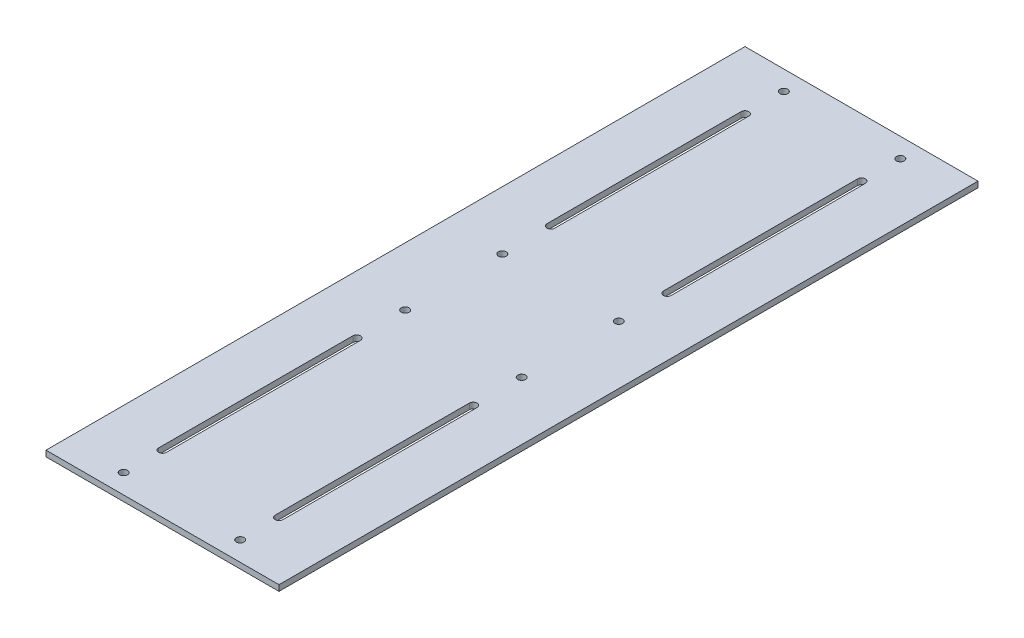
ISO-10303-21;
HEADER;
FILE_DESCRIPTION(('STEP AP214'),'2;1');
FILE_NAME('part.step','',(''),(''),'','','');
FILE_SCHEMA(('AUTOMOTIVE_DESIGN { 1 0 10303 214 1 1 1 1 }'));
ENDSEC;
DATA;
#1=APPLICATION_CONTEXT('core data for automotive mechanical design processes');
#2=APPLICATION_PROTOCOL_DEFINITION('international standard','automotive_design',2000,#1);
#3=PRODUCT_CONTEXT('',#1,'mechanical');
#4=PRODUCT('Part','Part','',(#3));
#5=PRODUCT_RELATED_PRODUCT_CATEGORY('part','',(#4));
#6=PRODUCT_DEFINITION_FORMATION('','',#4);
#7=PRODUCT_DEFINITION_CONTEXT('part definition',#1,'design');
#8=PRODUCT_DEFINITION('design','',#6,#7);
#9=PRODUCT_DEFINITION_SHAPE('','',#8);
#10=(LENGTH_UNIT() NAMED_UNIT(*) SI_UNIT(.MILLI.,.METRE.));
#11=(NAMED_UNIT(*) PLANE_ANGLE_UNIT() SI_UNIT($,.RADIAN.));
#12=(NAMED_UNIT(*) SI_UNIT($,.STERADIAN.) SOLID_ANGLE_UNIT());
#13=UNCERTAINTY_MEASURE_WITH_UNIT(LENGTH_MEASURE(1.E-05),#10,'distance_accuracy_value','');
#14=(GEOMETRIC_REPRESENTATION_CONTEXT(3) GLOBAL_UNCERTAINTY_ASSIGNED_CONTEXT((#13)) GLOBAL_UNIT_ASSIGNED_CONTEXT((#10,
#11,#12)) REPRESENTATION_CONTEXT('',''));
#15=CARTESIAN_POINT('',(0.,0.,0.));
#16=DIRECTION('',(0.,0.,1.));
#17=DIRECTION('',(1.,0.,0.));
#18=AXIS2_PLACEMENT_3D('',#15,#16,#17);
#19=CARTESIAN_POINT('',(60.,3.,180.));
#20=DIRECTION('',(-1.,0.,0.));
#21=DIRECTION('',(0.,0.,1.));
#22=AXIS2_PLACEMENT_3D('',#19,#20,#21);
#23=PLANE('',#22);
#24=DIRECTION('',(0.,0.,-1.));
#25=VECTOR('',#24,1.);
#26=CARTESIAN_POINT('',(60.,0.,180.));
#27=LINE('',#26,#25);
#28=CARTESIAN_POINT('',(60.,0.,180.));
#29=VERTEX_POINT('',#28);
#30=CARTESIAN_POINT('',(60.,0.,-180.));
#31=VERTEX_POINT('',#30);
#32=EDGE_CURVE('E347',#29,#31,#27,.T.);
#33=ORIENTED_EDGE('',*,*,#32,.T.);
#34=DIRECTION('',(0.,-1.,0.));
#35=VECTOR('',#34,1.);
#36=CARTESIAN_POINT('',(60.,3.,-180.));
#37=LINE('',#36,#35);
#38=CARTESIAN_POINT('',(60.,3.,-180.));
#39=VERTEX_POINT('',#38);
#40=EDGE_CURVE('E11',#39,#31,#37,.T.);
#41=ORIENTED_EDGE('',*,*,#40,.F.);
#42=DIRECTION('',(0.,0.,-1.));
#43=VECTOR('',#42,1.);
#44=CARTESIAN_POINT('',(60.,3.,180.));
#45=LINE('',#44,#43);
#46=CARTESIAN_POINT('',(60.,3.,180.));
#47=VERTEX_POINT('',#46);
#48=EDGE_CURVE('E350',#47,#39,#45,.T.);
#49=ORIENTED_EDGE('',*,*,#48,.F.);
#50=DIRECTION('',(0.,-1.,0.));
#51=VECTOR('',#50,1.);
#52=CARTESIAN_POINT('',(60.,3.,180.));
#53=LINE('',#52,#51);
#54=EDGE_CURVE('E360',#47,#29,#53,.T.);
#55=ORIENTED_EDGE('',*,*,#54,.T.);
#56=EDGE_LOOP('',(#33,#41,#49,#55));
#57=FACE_BOUND('',#56,.T.);
#58=ADVANCED_FACE('F33',(#57),#23,.F.);
#59=CARTESIAN_POINT('',(-60.,3.,-180.));
#60=DIRECTION('',(0.,0.,1.));
#61=DIRECTION('',(1.,0.,0.));
#62=AXIS2_PLACEMENT_3D('',#59,#60,#61);
#63=PLANE('',#62);
#64=DIRECTION('',(-1.,0.,0.));
#65=VECTOR('',#64,1.);
#66=CARTESIAN_POINT('',(-60.,0.,-180.));
#67=LINE('',#66,#65);
#68=CARTESIAN_POINT('',(-60.,0.,-180.));
#69=VERTEX_POINT('',#68);
#70=EDGE_CURVE('E363',#31,#69,#67,.T.);
#71=ORIENTED_EDGE('',*,*,#70,.T.);
#72=DIRECTION('',(0.,-1.,0.));
#73=VECTOR('',#72,1.);
#74=CARTESIAN_POINT('',(-60.,3.,-180.));
#75=LINE('',#74,#73);
#76=CARTESIAN_POINT('',(-60.,3.,-180.));
#77=VERTEX_POINT('',#76);
#78=EDGE_CURVE('E40',#77,#69,#75,.T.);
#79=ORIENTED_EDGE('',*,*,#78,.F.);
#80=DIRECTION('',(-1.,0.,0.));
#81=VECTOR('',#80,1.);
#82=CARTESIAN_POINT('',(-60.,3.,-180.));
#83=LINE('',#82,#81);
#84=EDGE_CURVE('E353',#39,#77,#83,.T.);
#85=ORIENTED_EDGE('',*,*,#84,.F.);
#86=ORIENTED_EDGE('',*,*,#40,.T.);
#87=EDGE_LOOP('',(#71,#79,#85,#86));
#88=FACE_BOUND('',#87,.T.);
#89=ADVANCED_FACE('F392',(#88),#63,.F.);
#90=CARTESIAN_POINT('',(-60.,3.,180.));
#91=DIRECTION('',(1.,0.,0.));
#92=DIRECTION('',(0.,0.,-1.));
#93=AXIS2_PLACEMENT_3D('',#90,#91,#92);
#94=PLANE('',#93);
#95=DIRECTION('',(0.,0.,1.));
#96=VECTOR('',#95,1.);
#97=CARTESIAN_POINT('',(-60.,0.,180.));
#98=LINE('',#97,#96);
#99=CARTESIAN_POINT('',(-60.,0.,180.));
#100=VERTEX_POINT('',#99);
#101=EDGE_CURVE('E365',#69,#100,#98,.T.);
#102=ORIENTED_EDGE('',*,*,#101,.T.);
#103=DIRECTION('',(0.,-1.,0.));
#104=VECTOR('',#103,1.);
#105=CARTESIAN_POINT('',(-60.,3.,180.));
#106=LINE('',#105,#104);
#107=CARTESIAN_POINT('',(-60.,3.,180.));
#108=VERTEX_POINT('',#107);
#109=EDGE_CURVE('E370',#108,#100,#106,.T.);
#110=ORIENTED_EDGE('',*,*,#109,.F.);
#111=DIRECTION('',(0.,0.,1.));
#112=VECTOR('',#111,1.);
#113=CARTESIAN_POINT('',(-60.,3.,180.));
#114=LINE('',#113,#112);
#115=EDGE_CURVE('E356',#77,#108,#114,.T.);
#116=ORIENTED_EDGE('',*,*,#115,.F.);
#117=ORIENTED_EDGE('',*,*,#78,.T.);
#118=EDGE_LOOP('',(#102,#110,#116,#117));
#119=FACE_BOUND('',#118,.T.);
#120=ADVANCED_FACE('F377',(#119),#94,.F.);
#121=CARTESIAN_POINT('',(-60.,3.,180.));
#122=DIRECTION('',(0.,0.,-1.));
#123=DIRECTION('',(-1.,0.,0.));
#124=AXIS2_PLACEMENT_3D('',#121,#122,#123);
#125=PLANE('',#124);
#126=DIRECTION('',(1.,0.,0.));
#127=VECTOR('',#126,1.);
#128=CARTESIAN_POINT('',(-60.,0.,180.));
#129=LINE('',#128,#127);
#130=EDGE_CURVE('E354',#100,#29,#129,.T.);
#131=ORIENTED_EDGE('',*,*,#130,.T.);
#132=ORIENTED_EDGE('',*,*,#54,.F.);
#133=DIRECTION('',(1.,0.,0.));
#134=VECTOR('',#133,1.);
#135=CARTESIAN_POINT('',(-60.,3.,180.));
#136=LINE('',#135,#134);
#137=EDGE_CURVE('E358',#108,#47,#136,.T.);
#138=ORIENTED_EDGE('',*,*,#137,.F.);
#139=ORIENTED_EDGE('',*,*,#109,.T.);
#140=EDGE_LOOP('',(#131,#132,#138,#139));
#141=FACE_BOUND('',#140,.T.);
#142=ADVANCED_FACE('F385',(#141),#125,.F.);
#143=CARTESIAN_POINT('',(0.,3.,0.));
#144=DIRECTION('',(0.,-1.,0.));
#145=DIRECTION('',(0.,0.,-1.));
#146=AXIS2_PLACEMENT_3D('',#143,#144,#145);
#147=PLANE('',#146);
#148=DIRECTION('',(0.,0.,-1.));
#149=VECTOR('',#148,1.);
#150=CARTESIAN_POINT('',(-28.,3.,150.));
#151=LINE('',#150,#149);
#152=CARTESIAN_POINT('',(-28.,3.,150.));
#153=VERTEX_POINT('',#152);
#154=CARTESIAN_POINT('',(-28.,3.,50.));
#155=VERTEX_POINT('',#154);
#156=EDGE_CURVE('E196',#153,#155,#151,.T.);
#157=ORIENTED_EDGE('',*,*,#156,.F.);
#158=CARTESIAN_POINT('',(-30.,3.,150.));
#159=DIRECTION('',(0.,1.,0.));
#160=DIRECTION('',(0.,0.,1.));
#161=AXIS2_PLACEMENT_3D('',#158,#159,#160);
#162=CIRCLE('',#161,2.);
#163=CARTESIAN_POINT('',(-32.,3.,150.));
#164=VERTEX_POINT('',#163);
#165=EDGE_CURVE('E47',#164,#153,#162,.T.);
#166=ORIENTED_EDGE('',*,*,#165,.F.);
#167=DIRECTION('',(0.,0.,1.));
#168=VECTOR('',#167,1.);
#169=CARTESIAN_POINT('',(-32.,3.,150.));
#170=LINE('',#169,#168);
#171=CARTESIAN_POINT('',(-32.,3.,50.));
#172=VERTEX_POINT('',#171);
#173=EDGE_CURVE('E187',#172,#164,#170,.T.);
#174=ORIENTED_EDGE('',*,*,#173,.F.);
#175=CARTESIAN_POINT('',(-30.,3.,50.));
#176=DIRECTION('',(0.,1.,0.));
#177=DIRECTION('',(0.,0.,1.));
#178=AXIS2_PLACEMENT_3D('',#175,#176,#177);
#179=CIRCLE('',#178,2.);
#180=EDGE_CURVE('E190',#155,#172,#179,.T.);
#181=ORIENTED_EDGE('',*,*,#180,.F.);
#182=EDGE_LOOP('',(#157,#166,#174,#181));
#183=FACE_BOUND('',#182,.T.);
#184=DIRECTION('',(0.,0.,-1.));
#185=VECTOR('',#184,1.);
#186=CARTESIAN_POINT('',(32.,3.,150.));
#187=LINE('',#186,#185);
#188=CARTESIAN_POINT('',(32.,3.,150.));
#189=VERTEX_POINT('',#188);
#190=CARTESIAN_POINT('',(32.,3.,50.));
#191=VERTEX_POINT('',#190);
#192=EDGE_CURVE('E221',#189,#191,#187,.T.);
#193=ORIENTED_EDGE('',*,*,#192,.F.);
#194=CARTESIAN_POINT('',(30.,3.,150.));
#195=DIRECTION('',(0.,1.,0.));
#196=DIRECTION('',(0.,0.,1.));
#197=AXIS2_PLACEMENT_3D('',#194,#195,#196);
#198=CIRCLE('',#197,2.);
#199=CARTESIAN_POINT('',(28.,3.,150.));
#200=VERTEX_POINT('',#199);
#201=EDGE_CURVE('E202',#200,#189,#198,.T.);
#202=ORIENTED_EDGE('',*,*,#201,.F.);
#203=DIRECTION('',(0.,0.,1.));
#204=VECTOR('',#203,1.);
#205=CARTESIAN_POINT('',(28.,3.,150.));
#206=LINE('',#205,#204);
#207=CARTESIAN_POINT('',(28.,3.,50.));
#208=VERTEX_POINT('',#207);
#209=EDGE_CURVE('E210',#208,#200,#206,.T.);
#210=ORIENTED_EDGE('',*,*,#209,.F.);
#211=CARTESIAN_POINT('',(30.,3.,50.));
#212=DIRECTION('',(0.,1.,0.));
#213=DIRECTION('',(0.,0.,1.));
#214=AXIS2_PLACEMENT_3D('',#211,#212,#213);
#215=CIRCLE('',#214,2.);
#216=EDGE_CURVE('E224',#191,#208,#215,.T.);
#217=ORIENTED_EDGE('',*,*,#216,.F.);
#218=EDGE_LOOP('',(#193,#202,#210,#217));
#219=FACE_BOUND('',#218,.T.);
#220=DIRECTION('',(0.,0.,1.));
#221=VECTOR('',#220,1.);
#222=CARTESIAN_POINT('',(-32.,3.,-150.));
#223=LINE('',#222,#221);
#224=CARTESIAN_POINT('',(-32.,3.,-150.));
#225=VERTEX_POINT('',#224);
#226=CARTESIAN_POINT('',(-32.,3.,-50.));
#227=VERTEX_POINT('',#226);
#228=EDGE_CURVE('E253',#225,#227,#223,.T.);
#229=ORIENTED_EDGE('',*,*,#228,.F.);
#230=CARTESIAN_POINT('',(-30.,3.,-150.));
#231=DIRECTION('',(0.,1.,0.));
#232=DIRECTION('',(0.,0.,1.));
#233=AXIS2_PLACEMENT_3D('',#230,#231,#232);
#234=CIRCLE('',#233,2.00000000000001);
#235=CARTESIAN_POINT('',(-28.,3.,-150.));
#236=VERTEX_POINT('',#235);
#237=EDGE_CURVE('E231',#236,#225,#234,.T.);
#238=ORIENTED_EDGE('',*,*,#237,.F.);
#239=DIRECTION('',(0.,0.,-1.));
#240=VECTOR('',#239,1.);
#241=CARTESIAN_POINT('',(-28.,3.,-150.));
#242=LINE('',#241,#240);
#243=CARTESIAN_POINT('',(-28.,3.,-50.));
#244=VERTEX_POINT('',#243);
#245=EDGE_CURVE('E242',#244,#236,#242,.T.);
#246=ORIENTED_EDGE('',*,*,#245,.F.);
#247=CARTESIAN_POINT('',(-30.,3.,-50.));
#248=DIRECTION('',(0.,1.,0.));
#249=DIRECTION('',(0.,0.,1.));
#250=AXIS2_PLACEMENT_3D('',#247,#248,#249);
#251=CIRCLE('',#250,2.);
#252=EDGE_CURVE('E256',#227,#244,#251,.T.);
#253=ORIENTED_EDGE('',*,*,#252,.F.);
#254=EDGE_LOOP('',(#229,#238,#246,#253));
#255=FACE_BOUND('',#254,.T.);
#256=DIRECTION('',(0.,0.,1.));
#257=VECTOR('',#256,1.);
#258=CARTESIAN_POINT('',(28.,3.,-150.));
#259=LINE('',#258,#257);
#260=CARTESIAN_POINT('',(28.,3.,-150.));
#261=VERTEX_POINT('',#260);
#262=CARTESIAN_POINT('',(28.,3.,-50.));
#263=VERTEX_POINT('',#262);
#264=EDGE_CURVE('E285',#261,#263,#259,.T.);
#265=ORIENTED_EDGE('',*,*,#264,.F.);
#266=CARTESIAN_POINT('',(30.,3.,-150.));
#267=DIRECTION('',(0.,1.,0.));
#268=DIRECTION('',(0.,0.,1.));
#269=AXIS2_PLACEMENT_3D('',#266,#267,#268);
#270=CIRCLE('',#269,2.00000000000001);
#271=CARTESIAN_POINT('',(32.,3.,-150.));
#272=VERTEX_POINT('',#271);
#273=EDGE_CURVE('E263',#272,#261,#270,.T.);
#274=ORIENTED_EDGE('',*,*,#273,.F.);
#275=DIRECTION('',(0.,0.,-1.));
#276=VECTOR('',#275,1.);
#277=CARTESIAN_POINT('',(32.,3.,-150.));
#278=LINE('',#277,#276);
#279=CARTESIAN_POINT('',(32.,3.,-50.));
#280=VERTEX_POINT('',#279);
#281=EDGE_CURVE('E274',#280,#272,#278,.T.);
#282=ORIENTED_EDGE('',*,*,#281,.F.);
#283=CARTESIAN_POINT('',(30.,3.,-50.));
#284=DIRECTION('',(0.,1.,0.));
#285=DIRECTION('',(0.,0.,1.));
#286=AXIS2_PLACEMENT_3D('',#283,#284,#285);
#287=CIRCLE('',#286,2.);
#288=EDGE_CURVE('E288',#263,#280,#287,.T.);
#289=ORIENTED_EDGE('',*,*,#288,.F.);
#290=EDGE_LOOP('',(#265,#274,#282,#289));
#291=FACE_BOUND('',#290,.T.);
#292=CARTESIAN_POINT('',(30.,3.,25.));
#293=DIRECTION('',(0.,1.,0.));
#294=DIRECTION('',(0.,0.,1.));
#295=AXIS2_PLACEMENT_3D('',#292,#293,#294);
#296=CIRCLE('',#295,2.);
#297=CARTESIAN_POINT('',(30.,3.,27.));
#298=VERTEX_POINT('',#297);
#299=EDGE_CURVE('E295',#298,#298,#296,.T.);
#300=ORIENTED_EDGE('',*,*,#299,.F.);
#301=EDGE_LOOP('',(#300));
#302=FACE_BOUND('',#301,.T.);
#303=CARTESIAN_POINT('',(-30.,3.,25.));
#304=DIRECTION('',(0.,1.,0.));
#305=DIRECTION('',(0.,0.,1.));
#306=AXIS2_PLACEMENT_3D('',#303,#304,#305);
#307=CIRCLE('',#306,2.);
#308=CARTESIAN_POINT('',(-30.,3.,27.));
#309=VERTEX_POINT('',#308);
#310=EDGE_CURVE('E305',#309,#309,#307,.T.);
#311=ORIENTED_EDGE('',*,*,#310,.F.);
#312=EDGE_LOOP('',(#311));
#313=FACE_BOUND('',#312,.T.);
#314=CARTESIAN_POINT('',(30.,3.,-25.));
#315=DIRECTION('',(0.,1.,0.));
#316=DIRECTION('',(0.,0.,1.));
#317=AXIS2_PLACEMENT_3D('',#314,#315,#316);
#318=CIRCLE('',#317,2.);
#319=CARTESIAN_POINT('',(30.,3.,-23.));
#320=VERTEX_POINT('',#319);
#321=EDGE_CURVE('E311',#320,#320,#318,.T.);
#322=ORIENTED_EDGE('',*,*,#321,.F.);
#323=EDGE_LOOP('',(#322));
#324=FACE_BOUND('',#323,.T.);
#325=CARTESIAN_POINT('',(30.,3.,170.));
#326=DIRECTION('',(0.,1.,0.));
#327=DIRECTION('',(0.,0.,1.));
#328=AXIS2_PLACEMENT_3D('',#325,#326,#327);
#329=CIRCLE('',#328,2.);
#330=CARTESIAN_POINT('',(30.,3.,172.));
#331=VERTEX_POINT('',#330);
#332=EDGE_CURVE('E317',#331,#331,#329,.T.);
#333=ORIENTED_EDGE('',*,*,#332,.F.);
#334=EDGE_LOOP('',(#333));
#335=FACE_BOUND('',#334,.T.);
#336=CARTESIAN_POINT('',(-30.,3.,-25.));
#337=DIRECTION('',(0.,1.,0.));
#338=DIRECTION('',(0.,0.,1.));
#339=AXIS2_PLACEMENT_3D('',#336,#337,#338);
#340=CIRCLE('',#339,2.);
#341=CARTESIAN_POINT('',(-30.,3.,-23.));
#342=VERTEX_POINT('',#341);
#343=EDGE_CURVE('E323',#342,#342,#340,.T.);
#344=ORIENTED_EDGE('',*,*,#343,.F.);
#345=EDGE_LOOP('',(#344));
#346=FACE_BOUND('',#345,.T.);
#347=CARTESIAN_POINT('',(-30.,3.,170.));
#348=DIRECTION('',(0.,1.,0.));
#349=DIRECTION('',(0.,0.,1.));
#350=AXIS2_PLACEMENT_3D('',#347,#348,#349);
#351=CIRCLE('',#350,2.);
#352=CARTESIAN_POINT('',(-30.,3.,172.));
#353=VERTEX_POINT('',#352);
#354=EDGE_CURVE('E329',#353,#353,#351,.T.);
#355=ORIENTED_EDGE('',*,*,#354,.F.);
#356=EDGE_LOOP('',(#355));
#357=FACE_BOUND('',#356,.T.);
#358=CARTESIAN_POINT('',(30.,3.,-170.));
#359=DIRECTION('',(0.,1.,0.));
#360=DIRECTION('',(0.,0.,1.));
#361=AXIS2_PLACEMENT_3D('',#358,#359,#360);
#362=CIRCLE('',#361,2.);
#363=CARTESIAN_POINT('',(30.,3.,-168.));
#364=VERTEX_POINT('',#363);
#365=EDGE_CURVE('E335',#364,#364,#362,.T.);
#366=ORIENTED_EDGE('',*,*,#365,.F.);
#367=EDGE_LOOP('',(#366));
#368=FACE_BOUND('',#367,.T.);
#369=CARTESIAN_POINT('',(-30.,3.,-170.));
#370=DIRECTION('',(0.,1.,0.));
#371=DIRECTION('',(0.,0.,1.));
#372=AXIS2_PLACEMENT_3D('',#369,#370,#371);
#373=CIRCLE('',#372,2.);
#374=CARTESIAN_POINT('',(-30.,3.,-168.));
#375=VERTEX_POINT('',#374);
#376=EDGE_CURVE('E341',#375,#375,#373,.T.);
#377=ORIENTED_EDGE('',*,*,#376,.F.);
#378=EDGE_LOOP('',(#377));
#379=FACE_BOUND('',#378,.T.);
#380=ORIENTED_EDGE('',*,*,#48,.T.);
#381=ORIENTED_EDGE('',*,*,#84,.T.);
#382=ORIENTED_EDGE('',*,*,#115,.T.);
#383=ORIENTED_EDGE('',*,*,#137,.T.);
#384=EDGE_LOOP('',(#380,#381,#382,#383));
#385=FACE_BOUND('',#384,.T.);
#386=ADVANCED_FACE('F391',(#183,#219,#255,#291,#302,#313,#324,#335,#346,#357,#368,#379,#385),
#147,.F.);
#387=CARTESIAN_POINT('',(0.,0.,0.));
#388=DIRECTION('',(0.,-1.,0.));
#389=DIRECTION('',(0.,0.,-1.));
#390=AXIS2_PLACEMENT_3D('',#387,#388,#389);
#391=PLANE('',#390);
#392=CARTESIAN_POINT('',(-30.,0.,150.));
#393=DIRECTION('',(0.,1.,0.));
#394=DIRECTION('',(0.,0.,1.));
#395=AXIS2_PLACEMENT_3D('',#392,#393,#394);
#396=CIRCLE('',#395,2.);
#397=CARTESIAN_POINT('',(-32.,0.,150.));
#398=VERTEX_POINT('',#397);
#399=CARTESIAN_POINT('',(-28.,0.,150.));
#400=VERTEX_POINT('',#399);
#401=EDGE_CURVE('E171',#398,#400,#396,.T.);
#402=ORIENTED_EDGE('',*,*,#401,.T.);
#403=DIRECTION('',(0.,0.,-1.));
#404=VECTOR('',#403,1.);
#405=CARTESIAN_POINT('',(-28.,0.,150.));
#406=LINE('',#405,#404);
#407=CARTESIAN_POINT('',(-28.,0.,50.));
#408=VERTEX_POINT('',#407);
#409=EDGE_CURVE('E180',#400,#408,#406,.T.);
#410=ORIENTED_EDGE('',*,*,#409,.T.);
#411=CARTESIAN_POINT('',(-30.,0.,50.));
#412=DIRECTION('',(0.,1.,0.));
#413=DIRECTION('',(0.,0.,1.));
#414=AXIS2_PLACEMENT_3D('',#411,#412,#413);
#415=CIRCLE('',#414,2.);
#416=CARTESIAN_POINT('',(-32.,0.,50.));
#417=VERTEX_POINT('',#416);
#418=EDGE_CURVE('E55',#408,#417,#415,.T.);
#419=ORIENTED_EDGE('',*,*,#418,.T.);
#420=DIRECTION('',(0.,0.,1.));
#421=VECTOR('',#420,1.);
#422=CARTESIAN_POINT('',(-32.,0.,150.));
#423=LINE('',#422,#421);
#424=EDGE_CURVE('E177',#417,#398,#423,.T.);
#425=ORIENTED_EDGE('',*,*,#424,.T.);
#426=EDGE_LOOP('',(#402,#410,#419,#425));
#427=FACE_BOUND('',#426,.T.);
#428=CARTESIAN_POINT('',(30.,0.,150.));
#429=DIRECTION('',(0.,1.,0.));
#430=DIRECTION('',(0.,0.,1.));
#431=AXIS2_PLACEMENT_3D('',#428,#429,#430);
#432=CIRCLE('',#431,2.);
#433=CARTESIAN_POINT('',(28.,0.,150.));
#434=VERTEX_POINT('',#433);
#435=CARTESIAN_POINT('',(32.,0.,150.));
#436=VERTEX_POINT('',#435);
#437=EDGE_CURVE('E206',#434,#436,#432,.T.);
#438=ORIENTED_EDGE('',*,*,#437,.T.);
#439=DIRECTION('',(0.,0.,-1.));
#440=VECTOR('',#439,1.);
#441=CARTESIAN_POINT('',(32.,0.,150.));
#442=LINE('',#441,#440);
#443=CARTESIAN_POINT('',(32.,0.,50.));
#444=VERTEX_POINT('',#443);
#445=EDGE_CURVE('E209',#436,#444,#442,.T.);
#446=ORIENTED_EDGE('',*,*,#445,.T.);
#447=CARTESIAN_POINT('',(30.,0.,50.));
#448=DIRECTION('',(0.,1.,0.));
#449=DIRECTION('',(0.,0.,1.));
#450=AXIS2_PLACEMENT_3D('',#447,#448,#449);
#451=CIRCLE('',#450,2.);
#452=CARTESIAN_POINT('',(28.,0.,50.));
#453=VERTEX_POINT('',#452);
#454=EDGE_CURVE('E213',#444,#453,#451,.T.);
#455=ORIENTED_EDGE('',*,*,#454,.T.);
#456=DIRECTION('',(0.,0.,1.));
#457=VECTOR('',#456,1.);
#458=CARTESIAN_POINT('',(28.,0.,150.));
#459=LINE('',#458,#457);
#460=EDGE_CURVE('E216',#453,#434,#459,.T.);
#461=ORIENTED_EDGE('',*,*,#460,.T.);
#462=EDGE_LOOP('',(#438,#446,#455,#461));
#463=FACE_BOUND('',#462,.T.);
#464=CARTESIAN_POINT('',(-30.,0.,-150.));
#465=DIRECTION('',(0.,1.,0.));
#466=DIRECTION('',(0.,0.,1.));
#467=AXIS2_PLACEMENT_3D('',#464,#465,#466);
#468=CIRCLE('',#467,2.00000000000001);
#469=CARTESIAN_POINT('',(-28.,0.,-150.));
#470=VERTEX_POINT('',#469);
#471=CARTESIAN_POINT('',(-32.,0.,-150.));
#472=VERTEX_POINT('',#471);
#473=EDGE_CURVE('E238',#470,#472,#468,.T.);
#474=ORIENTED_EDGE('',*,*,#473,.T.);
#475=DIRECTION('',(0.,0.,1.));
#476=VECTOR('',#475,1.);
#477=CARTESIAN_POINT('',(-32.,0.,-150.));
#478=LINE('',#477,#476);
#479=CARTESIAN_POINT('',(-32.,0.,-50.));
#480=VERTEX_POINT('',#479);
#481=EDGE_CURVE('E241',#472,#480,#478,.T.);
#482=ORIENTED_EDGE('',*,*,#481,.T.);
#483=CARTESIAN_POINT('',(-30.,0.,-50.));
#484=DIRECTION('',(0.,1.,0.));
#485=DIRECTION('',(0.,0.,1.));
#486=AXIS2_PLACEMENT_3D('',#483,#484,#485);
#487=CIRCLE('',#486,2.);
#488=CARTESIAN_POINT('',(-28.,0.,-50.));
#489=VERTEX_POINT('',#488);
#490=EDGE_CURVE('E245',#480,#489,#487,.T.);
#491=ORIENTED_EDGE('',*,*,#490,.T.);
#492=DIRECTION('',(0.,0.,-1.));
#493=VECTOR('',#492,1.);
#494=CARTESIAN_POINT('',(-28.,0.,-150.));
#495=LINE('',#494,#493);
#496=EDGE_CURVE('E248',#489,#470,#495,.T.);
#497=ORIENTED_EDGE('',*,*,#496,.T.);
#498=EDGE_LOOP('',(#474,#482,#491,#497));
#499=FACE_BOUND('',#498,.T.);
#500=CARTESIAN_POINT('',(30.,0.,-150.));
#501=DIRECTION('',(0.,1.,0.));
#502=DIRECTION('',(0.,0.,1.));
#503=AXIS2_PLACEMENT_3D('',#500,#501,#502);
#504=CIRCLE('',#503,2.00000000000001);
#505=CARTESIAN_POINT('',(32.,0.,-150.));
#506=VERTEX_POINT('',#505);
#507=CARTESIAN_POINT('',(28.,0.,-150.));
#508=VERTEX_POINT('',#507);
#509=EDGE_CURVE('E270',#506,#508,#504,.T.);
#510=ORIENTED_EDGE('',*,*,#509,.T.);
#511=DIRECTION('',(0.,0.,1.));
#512=VECTOR('',#511,1.);
#513=CARTESIAN_POINT('',(28.,0.,-150.));
#514=LINE('',#513,#512);
#515=CARTESIAN_POINT('',(28.,0.,-50.));
#516=VERTEX_POINT('',#515);
#517=EDGE_CURVE('E273',#508,#516,#514,.T.);
#518=ORIENTED_EDGE('',*,*,#517,.T.);
#519=CARTESIAN_POINT('',(30.,0.,-50.));
#520=DIRECTION('',(0.,1.,0.));
#521=DIRECTION('',(0.,0.,1.));
#522=AXIS2_PLACEMENT_3D('',#519,#520,#521);
#523=CIRCLE('',#522,2.);
#524=CARTESIAN_POINT('',(32.,0.,-50.));
#525=VERTEX_POINT('',#524);
#526=EDGE_CURVE('E277',#516,#525,#523,.T.);
#527=ORIENTED_EDGE('',*,*,#526,.T.);
#528=DIRECTION('',(0.,0.,-1.));
#529=VECTOR('',#528,1.);
#530=CARTESIAN_POINT('',(32.,0.,-150.));
#531=LINE('',#530,#529);
#532=EDGE_CURVE('E280',#525,#506,#531,.T.);
#533=ORIENTED_EDGE('',*,*,#532,.T.);
#534=EDGE_LOOP('',(#510,#518,#527,#533));
#535=FACE_BOUND('',#534,.T.);
#536=CARTESIAN_POINT('',(30.,0.,25.));
#537=DIRECTION('',(0.,1.,0.));
#538=DIRECTION('',(0.,0.,1.));
#539=AXIS2_PLACEMENT_3D('',#536,#537,#538);
#540=CIRCLE('',#539,2.);
#541=CARTESIAN_POINT('',(30.,0.,27.));
#542=VERTEX_POINT('',#541);
#543=EDGE_CURVE('E302',#542,#542,#540,.T.);
#544=ORIENTED_EDGE('',*,*,#543,.T.);
#545=EDGE_LOOP('',(#544));
#546=FACE_BOUND('',#545,.T.);
#547=CARTESIAN_POINT('',(-30.,0.,25.));
#548=DIRECTION('',(0.,1.,0.));
#549=DIRECTION('',(0.,0.,1.));
#550=AXIS2_PLACEMENT_3D('',#547,#548,#549);
#551=CIRCLE('',#550,2.);
#552=CARTESIAN_POINT('',(-30.,0.,27.));
#553=VERTEX_POINT('',#552);
#554=EDGE_CURVE('E308',#553,#553,#551,.T.);
#555=ORIENTED_EDGE('',*,*,#554,.T.);
#556=EDGE_LOOP('',(#555));
#557=FACE_BOUND('',#556,.T.);
#558=CARTESIAN_POINT('',(30.,0.,-25.));
#559=DIRECTION('',(0.,1.,0.));
#560=DIRECTION('',(0.,0.,1.));
#561=AXIS2_PLACEMENT_3D('',#558,#559,#560);
#562=CIRCLE('',#561,2.);
#563=CARTESIAN_POINT('',(30.,0.,-23.));
#564=VERTEX_POINT('',#563);
#565=EDGE_CURVE('E314',#564,#564,#562,.T.);
#566=ORIENTED_EDGE('',*,*,#565,.T.);
#567=EDGE_LOOP('',(#566));
#568=FACE_BOUND('',#567,.T.);
#569=CARTESIAN_POINT('',(30.,0.,170.));
#570=DIRECTION('',(0.,1.,0.));
#571=DIRECTION('',(0.,0.,1.));
#572=AXIS2_PLACEMENT_3D('',#569,#570,#571);
#573=CIRCLE('',#572,2.);
#574=CARTESIAN_POINT('',(30.,0.,172.));
#575=VERTEX_POINT('',#574);
#576=EDGE_CURVE('E320',#575,#575,#573,.T.);
#577=ORIENTED_EDGE('',*,*,#576,.T.);
#578=EDGE_LOOP('',(#577));
#579=FACE_BOUND('',#578,.T.);
#580=CARTESIAN_POINT('',(-30.,0.,-25.));
#581=DIRECTION('',(0.,1.,0.));
#582=DIRECTION('',(0.,0.,1.));
#583=AXIS2_PLACEMENT_3D('',#580,#581,#582);
#584=CIRCLE('',#583,2.);
#585=CARTESIAN_POINT('',(-30.,0.,-23.));
#586=VERTEX_POINT('',#585);
#587=EDGE_CURVE('E326',#586,#586,#584,.T.);
#588=ORIENTED_EDGE('',*,*,#587,.T.);
#589=EDGE_LOOP('',(#588));
#590=FACE_BOUND('',#589,.T.);
#591=CARTESIAN_POINT('',(-30.,0.,170.));
#592=DIRECTION('',(0.,1.,0.));
#593=DIRECTION('',(0.,0.,1.));
#594=AXIS2_PLACEMENT_3D('',#591,#592,#593);
#595=CIRCLE('',#594,2.);
#596=CARTESIAN_POINT('',(-30.,0.,172.));
#597=VERTEX_POINT('',#596);
#598=EDGE_CURVE('E332',#597,#597,#595,.T.);
#599=ORIENTED_EDGE('',*,*,#598,.T.);
#600=EDGE_LOOP('',(#599));
#601=FACE_BOUND('',#600,.T.);
#602=CARTESIAN_POINT('',(30.,0.,-170.));
#603=DIRECTION('',(0.,1.,0.));
#604=DIRECTION('',(0.,0.,1.));
#605=AXIS2_PLACEMENT_3D('',#602,#603,#604);
#606=CIRCLE('',#605,2.);
#607=CARTESIAN_POINT('',(30.,0.,-168.));
#608=VERTEX_POINT('',#607);
#609=EDGE_CURVE('E338',#608,#608,#606,.T.);
#610=ORIENTED_EDGE('',*,*,#609,.T.);
#611=EDGE_LOOP('',(#610));
#612=FACE_BOUND('',#611,.T.);
#613=CARTESIAN_POINT('',(-30.,0.,-170.));
#614=DIRECTION('',(0.,1.,0.));
#615=DIRECTION('',(0.,0.,1.));
#616=AXIS2_PLACEMENT_3D('',#613,#614,#615);
#617=CIRCLE('',#616,2.);
#618=CARTESIAN_POINT('',(-30.,0.,-168.));
#619=VERTEX_POINT('',#618);
#620=EDGE_CURVE('E344',#619,#619,#617,.T.);
#621=ORIENTED_EDGE('',*,*,#620,.T.);
#622=EDGE_LOOP('',(#621));
#623=FACE_BOUND('',#622,.T.);
#624=ORIENTED_EDGE('',*,*,#32,.F.);
#625=ORIENTED_EDGE('',*,*,#130,.F.);
#626=ORIENTED_EDGE('',*,*,#101,.F.);
#627=ORIENTED_EDGE('',*,*,#70,.F.);
#628=EDGE_LOOP('',(#624,#625,#626,#627));
#629=FACE_BOUND('',#628,.T.);
#630=ADVANCED_FACE('F184',(#427,#463,#499,#535,#546,#557,#568,#579,#590,#601,#612,#623,#629),
#391,.T.);
#631=CARTESIAN_POINT('',(-30.,0.,-170.));
#632=DIRECTION('',(0.,1.,0.));
#633=DIRECTION('',(0.,0.,1.));
#634=AXIS2_PLACEMENT_3D('',#631,#632,#633);
#635=CYLINDRICAL_SURFACE('',#634,2.);
#636=ORIENTED_EDGE('',*,*,#620,.F.);
#637=EDGE_LOOP('',(#636));
#638=FACE_BOUND('',#637,.T.);
#639=ORIENTED_EDGE('',*,*,#376,.T.);
#640=EDGE_LOOP('',(#639));
#641=FACE_BOUND('',#640,.T.);
#642=ADVANCED_FACE('F404',(#638,#641),#635,.F.);
#643=CARTESIAN_POINT('',(30.,0.,-170.));
#644=DIRECTION('',(0.,1.,0.));
#645=DIRECTION('',(0.,0.,1.));
#646=AXIS2_PLACEMENT_3D('',#643,#644,#645);
#647=CYLINDRICAL_SURFACE('',#646,2.);
#648=ORIENTED_EDGE('',*,*,#609,.F.);
#649=EDGE_LOOP('',(#648));
#650=FACE_BOUND('',#649,.T.);
#651=ORIENTED_EDGE('',*,*,#365,.T.);
#652=EDGE_LOOP('',(#651));
#653=FACE_BOUND('',#652,.T.);
#654=ADVANCED_FACE('F410',(#650,#653),#647,.F.);
#655=CARTESIAN_POINT('',(-30.,0.,170.));
#656=DIRECTION('',(0.,1.,0.));
#657=DIRECTION('',(0.,0.,1.));
#658=AXIS2_PLACEMENT_3D('',#655,#656,#657);
#659=CYLINDRICAL_SURFACE('',#658,2.);
#660=ORIENTED_EDGE('',*,*,#598,.F.);
#661=EDGE_LOOP('',(#660));
#662=FACE_BOUND('',#661,.T.);
#663=ORIENTED_EDGE('',*,*,#354,.T.);
#664=EDGE_LOOP('',(#663));
#665=FACE_BOUND('',#664,.T.);
#666=ADVANCED_FACE('F414',(#662,#665),#659,.F.);
#667=CARTESIAN_POINT('',(-30.,0.,-25.));
#668=DIRECTION('',(0.,1.,0.));
#669=DIRECTION('',(0.,0.,1.));
#670=AXIS2_PLACEMENT_3D('',#667,#668,#669);
#671=CYLINDRICAL_SURFACE('',#670,2.);
#672=ORIENTED_EDGE('',*,*,#587,.F.);
#673=EDGE_LOOP('',(#672));
#674=FACE_BOUND('',#673,.T.);
#675=ORIENTED_EDGE('',*,*,#343,.T.);
#676=EDGE_LOOP('',(#675));
#677=FACE_BOUND('',#676,.T.);
#678=ADVANCED_FACE('F418',(#674,#677),#671,.F.);
#679=CARTESIAN_POINT('',(30.,0.,170.));
#680=DIRECTION('',(0.,1.,0.));
#681=DIRECTION('',(0.,0.,1.));
#682=AXIS2_PLACEMENT_3D('',#679,#680,#681);
#683=CYLINDRICAL_SURFACE('',#682,2.);
#684=ORIENTED_EDGE('',*,*,#576,.F.);
#685=EDGE_LOOP('',(#684));
#686=FACE_BOUND('',#685,.T.);
#687=ORIENTED_EDGE('',*,*,#332,.T.);
#688=EDGE_LOOP('',(#687));
#689=FACE_BOUND('',#688,.T.);
#690=ADVANCED_FACE('F422',(#686,#689),#683,.F.);
#691=CARTESIAN_POINT('',(30.,0.,-25.));
#692=DIRECTION('',(0.,1.,0.));
#693=DIRECTION('',(0.,0.,1.));
#694=AXIS2_PLACEMENT_3D('',#691,#692,#693);
#695=CYLINDRICAL_SURFACE('',#694,2.);
#696=ORIENTED_EDGE('',*,*,#565,.F.);
#697=EDGE_LOOP('',(#696));
#698=FACE_BOUND('',#697,.T.);
#699=ORIENTED_EDGE('',*,*,#321,.T.);
#700=EDGE_LOOP('',(#699));
#701=FACE_BOUND('',#700,.T.);
#702=ADVANCED_FACE('F426',(#698,#701),#695,.F.);
#703=CARTESIAN_POINT('',(-30.,0.,25.));
#704=DIRECTION('',(0.,1.,0.));
#705=DIRECTION('',(0.,0.,1.));
#706=AXIS2_PLACEMENT_3D('',#703,#704,#705);
#707=CYLINDRICAL_SURFACE('',#706,2.);
#708=ORIENTED_EDGE('',*,*,#554,.F.);
#709=EDGE_LOOP('',(#708));
#710=FACE_BOUND('',#709,.T.);
#711=ORIENTED_EDGE('',*,*,#310,.T.);
#712=EDGE_LOOP('',(#711));
#713=FACE_BOUND('',#712,.T.);
#714=ADVANCED_FACE('F430',(#710,#713),#707,.F.);
#715=CARTESIAN_POINT('',(30.,0.,25.));
#716=DIRECTION('',(0.,1.,0.));
#717=DIRECTION('',(0.,0.,1.));
#718=AXIS2_PLACEMENT_3D('',#715,#716,#717);
#719=CYLINDRICAL_SURFACE('',#718,2.);
#720=ORIENTED_EDGE('',*,*,#543,.F.);
#721=EDGE_LOOP('',(#720));
#722=FACE_BOUND('',#721,.T.);
#723=ORIENTED_EDGE('',*,*,#299,.T.);
#724=EDGE_LOOP('',(#723));
#725=FACE_BOUND('',#724,.T.);
#726=ADVANCED_FACE('F434',(#722,#725),#719,.F.);
#727=CARTESIAN_POINT('',(30.,0.,-150.));
#728=DIRECTION('',(0.,1.,0.));
#729=DIRECTION('',(0.,0.,1.));
#730=AXIS2_PLACEMENT_3D('',#727,#728,#729);
#731=CYLINDRICAL_SURFACE('',#730,2.00000000000001);
#732=ORIENTED_EDGE('',*,*,#273,.T.);
#733=DIRECTION('',(0.,1.,0.));
#734=VECTOR('',#733,1.);
#735=CARTESIAN_POINT('',(28.,0.,-150.));
#736=LINE('',#735,#734);
#737=EDGE_CURVE('E283',#508,#261,#736,.T.);
#738=ORIENTED_EDGE('',*,*,#737,.F.);
#739=ORIENTED_EDGE('',*,*,#509,.F.);
#740=DIRECTION('',(0.,1.,0.));
#741=VECTOR('',#740,1.);
#742=CARTESIAN_POINT('',(32.,0.,-150.));
#743=LINE('',#742,#741);
#744=EDGE_CURVE('E293',#506,#272,#743,.T.);
#745=ORIENTED_EDGE('',*,*,#744,.T.);
#746=EDGE_LOOP('',(#732,#738,#739,#745));
#747=FACE_BOUND('',#746,.T.);
#748=ADVANCED_FACE('F438',(#747),#731,.F.);
#749=CARTESIAN_POINT('',(32.,0.,-150.));
#750=DIRECTION('',(1.,0.,0.));
#751=DIRECTION('',(0.,0.,-1.));
#752=AXIS2_PLACEMENT_3D('',#749,#750,#751);
#753=PLANE('',#752);
#754=ORIENTED_EDGE('',*,*,#281,.T.);
#755=ORIENTED_EDGE('',*,*,#744,.F.);
#756=ORIENTED_EDGE('',*,*,#532,.F.);
#757=DIRECTION('',(0.,1.,0.));
#758=VECTOR('',#757,1.);
#759=CARTESIAN_POINT('',(32.,0.,-50.));
#760=LINE('',#759,#758);
#761=EDGE_CURVE('E296',#525,#280,#760,.T.);
#762=ORIENTED_EDGE('',*,*,#761,.T.);
#763=EDGE_LOOP('',(#754,#755,#756,#762));
#764=FACE_BOUND('',#763,.T.);
#765=ADVANCED_FACE('F442',(#764),#753,.F.);
#766=CARTESIAN_POINT('',(30.,0.,-50.));
#767=DIRECTION('',(0.,1.,0.));
#768=DIRECTION('',(0.,0.,1.));
#769=AXIS2_PLACEMENT_3D('',#766,#767,#768);
#770=CYLINDRICAL_SURFACE('',#769,2.);
#771=ORIENTED_EDGE('',*,*,#288,.T.);
#772=ORIENTED_EDGE('',*,*,#761,.F.);
#773=ORIENTED_EDGE('',*,*,#526,.F.);
#774=DIRECTION('',(0.,1.,0.));
#775=VECTOR('',#774,1.);
#776=CARTESIAN_POINT('',(28.,0.,-50.));
#777=LINE('',#776,#775);
#778=EDGE_CURVE('E298',#516,#263,#777,.T.);
#779=ORIENTED_EDGE('',*,*,#778,.T.);
#780=EDGE_LOOP('',(#771,#772,#773,#779));
#781=FACE_BOUND('',#780,.T.);
#782=ADVANCED_FACE('F448',(#781),#770,.F.);
#783=CARTESIAN_POINT('',(28.,0.,-150.));
#784=DIRECTION('',(-1.,0.,0.));
#785=DIRECTION('',(0.,0.,1.));
#786=AXIS2_PLACEMENT_3D('',#783,#784,#785);
#787=PLANE('',#786);
#788=ORIENTED_EDGE('',*,*,#264,.T.);
#789=ORIENTED_EDGE('',*,*,#778,.F.);
#790=ORIENTED_EDGE('',*,*,#517,.F.);
#791=ORIENTED_EDGE('',*,*,#737,.T.);
#792=EDGE_LOOP('',(#788,#789,#790,#791));
#793=FACE_BOUND('',#792,.T.);
#794=ADVANCED_FACE('F444',(#793),#787,.F.);
#795=CARTESIAN_POINT('',(-30.,0.,-150.));
#796=DIRECTION('',(0.,1.,0.));
#797=DIRECTION('',(0.,0.,1.));
#798=AXIS2_PLACEMENT_3D('',#795,#796,#797);
#799=CYLINDRICAL_SURFACE('',#798,2.00000000000001);
#800=ORIENTED_EDGE('',*,*,#237,.T.);
#801=DIRECTION('',(0.,1.,0.));
#802=VECTOR('',#801,1.);
#803=CARTESIAN_POINT('',(-32.,0.,-150.));
#804=LINE('',#803,#802);
#805=EDGE_CURVE('E251',#472,#225,#804,.T.);
#806=ORIENTED_EDGE('',*,*,#805,.F.);
#807=ORIENTED_EDGE('',*,*,#473,.F.);
#808=DIRECTION('',(0.,1.,0.));
#809=VECTOR('',#808,1.);
#810=CARTESIAN_POINT('',(-28.,0.,-150.));
#811=LINE('',#810,#809);
#812=EDGE_CURVE('E261',#470,#236,#811,.T.);
#813=ORIENTED_EDGE('',*,*,#812,.T.);
#814=EDGE_LOOP('',(#800,#806,#807,#813));
#815=FACE_BOUND('',#814,.T.);
#816=ADVANCED_FACE('F447',(#815),#799,.F.);
#817=CARTESIAN_POINT('',(-28.,0.,-150.));
#818=DIRECTION('',(1.,0.,0.));
#819=DIRECTION('',(0.,0.,-1.));
#820=AXIS2_PLACEMENT_3D('',#817,#818,#819);
#821=PLANE('',#820);
#822=ORIENTED_EDGE('',*,*,#245,.T.);
#823=ORIENTED_EDGE('',*,*,#812,.F.);
#824=ORIENTED_EDGE('',*,*,#496,.F.);
#825=DIRECTION('',(0.,1.,0.));
#826=VECTOR('',#825,1.);
#827=CARTESIAN_POINT('',(-28.,0.,-50.));
#828=LINE('',#827,#826);
#829=EDGE_CURVE('E264',#489,#244,#828,.T.);
#830=ORIENTED_EDGE('',*,*,#829,.T.);
#831=EDGE_LOOP('',(#822,#823,#824,#830));
#832=FACE_BOUND('',#831,.T.);
#833=ADVANCED_FACE('F458',(#832),#821,.F.);
#834=CARTESIAN_POINT('',(-30.,0.,-50.));
#835=DIRECTION('',(0.,1.,0.));
#836=DIRECTION('',(0.,0.,1.));
#837=AXIS2_PLACEMENT_3D('',#834,#835,#836);
#838=CYLINDRICAL_SURFACE('',#837,2.);
#839=ORIENTED_EDGE('',*,*,#252,.T.);
#840=ORIENTED_EDGE('',*,*,#829,.F.);
#841=ORIENTED_EDGE('',*,*,#490,.F.);
#842=DIRECTION('',(0.,1.,0.));
#843=VECTOR('',#842,1.);
#844=CARTESIAN_POINT('',(-32.,0.,-50.));
#845=LINE('',#844,#843);
#846=EDGE_CURVE('E266',#480,#227,#845,.T.);
#847=ORIENTED_EDGE('',*,*,#846,.T.);
#848=EDGE_LOOP('',(#839,#840,#841,#847));
#849=FACE_BOUND('',#848,.T.);
#850=ADVANCED_FACE('F464',(#849),#838,.F.);
#851=CARTESIAN_POINT('',(-32.,0.,-150.));
#852=DIRECTION('',(-1.,0.,0.));
#853=DIRECTION('',(0.,0.,1.));
#854=AXIS2_PLACEMENT_3D('',#851,#852,#853);
#855=PLANE('',#854);
#856=ORIENTED_EDGE('',*,*,#228,.T.);
#857=ORIENTED_EDGE('',*,*,#846,.F.);
#858=ORIENTED_EDGE('',*,*,#481,.F.);
#859=ORIENTED_EDGE('',*,*,#805,.T.);
#860=EDGE_LOOP('',(#856,#857,#858,#859));
#861=FACE_BOUND('',#860,.T.);
#862=ADVANCED_FACE('F460',(#861),#855,.F.);
#863=CARTESIAN_POINT('',(30.,0.,150.));
#864=DIRECTION('',(0.,1.,0.));
#865=DIRECTION('',(0.,0.,1.));
#866=AXIS2_PLACEMENT_3D('',#863,#864,#865);
#867=CYLINDRICAL_SURFACE('',#866,2.);
#868=ORIENTED_EDGE('',*,*,#201,.T.);
#869=DIRECTION('',(0.,1.,0.));
#870=VECTOR('',#869,1.);
#871=CARTESIAN_POINT('',(32.,0.,150.));
#872=LINE('',#871,#870);
#873=EDGE_CURVE('E219',#436,#189,#872,.T.);
#874=ORIENTED_EDGE('',*,*,#873,.F.);
#875=ORIENTED_EDGE('',*,*,#437,.F.);
#876=DIRECTION('',(0.,1.,0.));
#877=VECTOR('',#876,1.);
#878=CARTESIAN_POINT('',(28.,0.,150.));
#879=LINE('',#878,#877);
#880=EDGE_CURVE('E229',#434,#200,#879,.T.);
#881=ORIENTED_EDGE('',*,*,#880,.T.);
#882=EDGE_LOOP('',(#868,#874,#875,#881));
#883=FACE_BOUND('',#882,.T.);
#884=ADVANCED_FACE('F463',(#883),#867,.F.);
#885=CARTESIAN_POINT('',(28.,0.,150.));
#886=DIRECTION('',(-1.,0.,0.));
#887=DIRECTION('',(0.,0.,1.));
#888=AXIS2_PLACEMENT_3D('',#885,#886,#887);
#889=PLANE('',#888);
#890=ORIENTED_EDGE('',*,*,#209,.T.);
#891=ORIENTED_EDGE('',*,*,#880,.F.);
#892=ORIENTED_EDGE('',*,*,#460,.F.);
#893=DIRECTION('',(0.,1.,0.));
#894=VECTOR('',#893,1.);
#895=CARTESIAN_POINT('',(28.,0.,50.));
#896=LINE('',#895,#894);
#897=EDGE_CURVE('E232',#453,#208,#896,.T.);
#898=ORIENTED_EDGE('',*,*,#897,.T.);
#899=EDGE_LOOP('',(#890,#891,#892,#898));
#900=FACE_BOUND('',#899,.T.);
#901=ADVANCED_FACE('F474',(#900),#889,.F.);
#902=CARTESIAN_POINT('',(30.,0.,50.));
#903=DIRECTION('',(0.,1.,0.));
#904=DIRECTION('',(0.,0.,1.));
#905=AXIS2_PLACEMENT_3D('',#902,#903,#904);
#906=CYLINDRICAL_SURFACE('',#905,2.);
#907=ORIENTED_EDGE('',*,*,#216,.T.);
#908=ORIENTED_EDGE('',*,*,#897,.F.);
#909=ORIENTED_EDGE('',*,*,#454,.F.);
#910=DIRECTION('',(0.,1.,0.));
#911=VECTOR('',#910,1.);
#912=CARTESIAN_POINT('',(32.,0.,50.));
#913=LINE('',#912,#911);
#914=EDGE_CURVE('E234',#444,#191,#913,.T.);
#915=ORIENTED_EDGE('',*,*,#914,.T.);
#916=EDGE_LOOP('',(#907,#908,#909,#915));
#917=FACE_BOUND('',#916,.T.);
#918=ADVANCED_FACE('F479',(#917),#906,.F.);
#919=CARTESIAN_POINT('',(32.,0.,150.));
#920=DIRECTION('',(1.,0.,0.));
#921=DIRECTION('',(0.,0.,-1.));
#922=AXIS2_PLACEMENT_3D('',#919,#920,#921);
#923=PLANE('',#922);
#924=ORIENTED_EDGE('',*,*,#192,.T.);
#925=ORIENTED_EDGE('',*,*,#914,.F.);
#926=ORIENTED_EDGE('',*,*,#445,.F.);
#927=ORIENTED_EDGE('',*,*,#873,.T.);
#928=EDGE_LOOP('',(#924,#925,#926,#927));
#929=FACE_BOUND('',#928,.T.);
#930=ADVANCED_FACE('F476',(#929),#923,.F.);
#931=CARTESIAN_POINT('',(-30.,0.,150.));
#932=DIRECTION('',(0.,1.,0.));
#933=DIRECTION('',(0.,0.,1.));
#934=AXIS2_PLACEMENT_3D('',#931,#932,#933);
#935=CYLINDRICAL_SURFACE('',#934,2.);
#936=ORIENTED_EDGE('',*,*,#165,.T.);
#937=DIRECTION('',(0.,1.,0.));
#938=VECTOR('',#937,1.);
#939=CARTESIAN_POINT('',(-28.,0.,150.));
#940=LINE('',#939,#938);
#941=EDGE_CURVE('E167',#400,#153,#940,.T.);
#942=ORIENTED_EDGE('',*,*,#941,.F.);
#943=ORIENTED_EDGE('',*,*,#401,.F.);
#944=DIRECTION('',(0.,1.,0.));
#945=VECTOR('',#944,1.);
#946=CARTESIAN_POINT('',(-32.,0.,150.));
#947=LINE('',#946,#945);
#948=EDGE_CURVE('E200',#398,#164,#947,.T.);
#949=ORIENTED_EDGE('',*,*,#948,.T.);
#950=EDGE_LOOP('',(#936,#942,#943,#949));
#951=FACE_BOUND('',#950,.T.);
#952=ADVANCED_FACE('F169',(#951),#935,.F.);
#953=CARTESIAN_POINT('',(-32.,0.,150.));
#954=DIRECTION('',(-1.,0.,0.));
#955=DIRECTION('',(0.,0.,1.));
#956=AXIS2_PLACEMENT_3D('',#953,#954,#955);
#957=PLANE('',#956);
#958=ORIENTED_EDGE('',*,*,#173,.T.);
#959=ORIENTED_EDGE('',*,*,#948,.F.);
#960=ORIENTED_EDGE('',*,*,#424,.F.);
#961=DIRECTION('',(0.,1.,0.));
#962=VECTOR('',#961,1.);
#963=CARTESIAN_POINT('',(-32.,0.,50.));
#964=LINE('',#963,#962);
#965=EDGE_CURVE('E203',#417,#172,#964,.T.);
#966=ORIENTED_EDGE('',*,*,#965,.T.);
#967=EDGE_LOOP('',(#958,#959,#960,#966));
#968=FACE_BOUND('',#967,.T.);
#969=ADVANCED_FACE('F489',(#968),#957,.F.);
#970=CARTESIAN_POINT('',(-30.,0.,50.));
#971=DIRECTION('',(0.,1.,0.));
#972=DIRECTION('',(0.,0.,1.));
#973=AXIS2_PLACEMENT_3D('',#970,#971,#972);
#974=CYLINDRICAL_SURFACE('',#973,2.);
#975=ORIENTED_EDGE('',*,*,#180,.T.);
#976=ORIENTED_EDGE('',*,*,#965,.F.);
#977=ORIENTED_EDGE('',*,*,#418,.F.);
#978=DIRECTION('',(0.,1.,0.));
#979=VECTOR('',#978,1.);
#980=CARTESIAN_POINT('',(-28.,0.,50.));
#981=LINE('',#980,#979);
#982=EDGE_CURVE('E176',#408,#155,#981,.T.);
#983=ORIENTED_EDGE('',*,*,#982,.T.);
#984=EDGE_LOOP('',(#975,#976,#977,#983));
#985=FACE_BOUND('',#984,.T.);
#986=ADVANCED_FACE('F492',(#985),#974,.F.);
#987=CARTESIAN_POINT('',(-28.,0.,150.));
#988=DIRECTION('',(1.,0.,0.));
#989=DIRECTION('',(0.,0.,-1.));
#990=AXIS2_PLACEMENT_3D('',#987,#988,#989);
#991=PLANE('',#990);
#992=ORIENTED_EDGE('',*,*,#156,.T.);
#993=ORIENTED_EDGE('',*,*,#982,.F.);
#994=ORIENTED_EDGE('',*,*,#409,.F.);
#995=ORIENTED_EDGE('',*,*,#941,.T.);
#996=EDGE_LOOP('',(#992,#993,#994,#995));
#997=FACE_BOUND('',#996,.T.);
#998=ADVANCED_FACE('F181',(#997),#991,.F.);
#999=CLOSED_SHELL('',(#58,#89,#120,#142,#386,#630,#642,#654,#666,#678,#690,#702,#714,#726,#748,
#765,#782,#794,#816,#833,#850,#862,#884,#901,#918,#930,#952,#969,#986,#998));
#1000=MANIFOLD_SOLID_BREP('B2',#999);
#1001=ADVANCED_BREP_SHAPE_REPRESENTATION('',(#18,#1000),#14);
#1002=SHAPE_DEFINITION_REPRESENTATION(#9,#1001);
ENDSEC;
END-ISO-10303-21;
